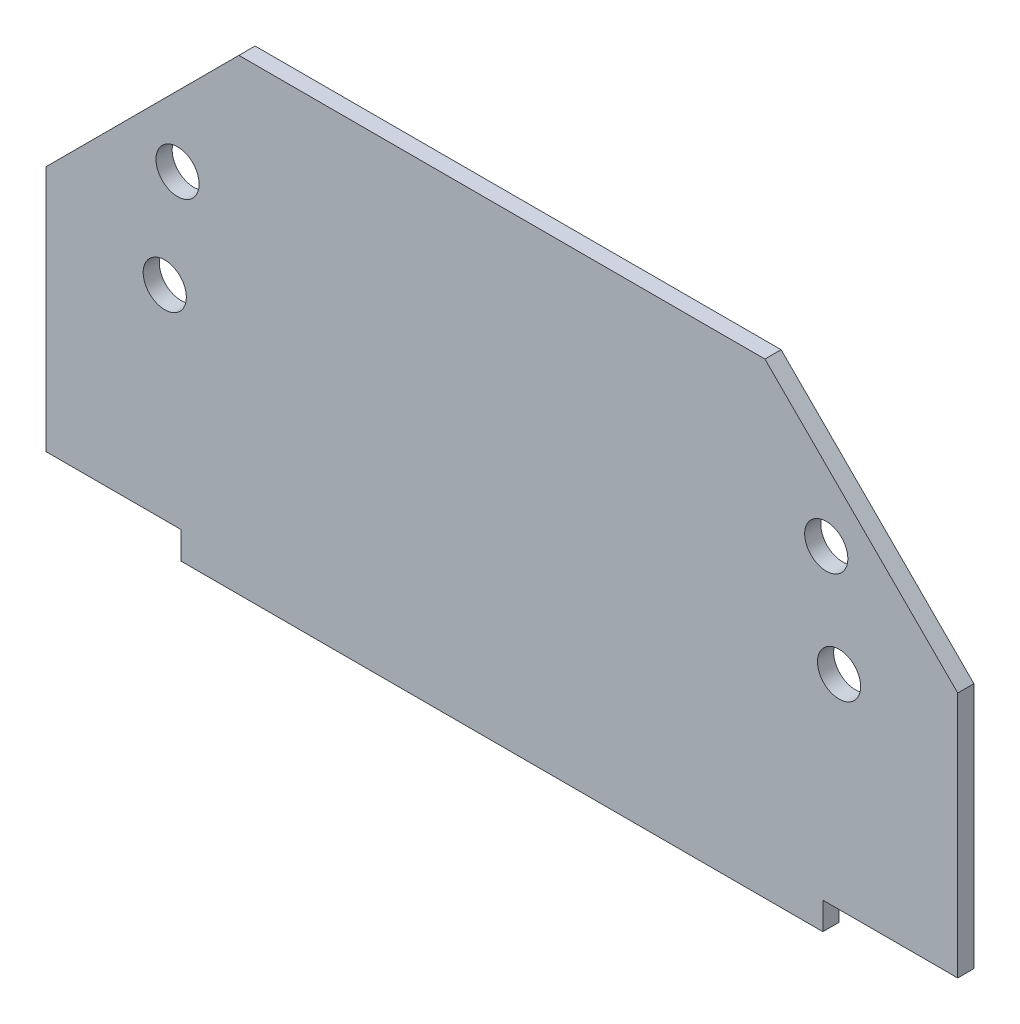
ISO-10303-21;
HEADER;
FILE_DESCRIPTION(('STEP AP214'),'2;1');
FILE_NAME('part.step','',(''),(''),'','','');
FILE_SCHEMA(('AUTOMOTIVE_DESIGN { 1 0 10303 214 1 1 1 1 }'));
ENDSEC;
DATA;
#1=APPLICATION_CONTEXT('core data for automotive mechanical design processes');
#2=APPLICATION_PROTOCOL_DEFINITION('international standard','automotive_design',2000,#1);
#3=PRODUCT_CONTEXT('',#1,'mechanical');
#4=PRODUCT('Part','Part','',(#3));
#5=PRODUCT_RELATED_PRODUCT_CATEGORY('part','',(#4));
#6=PRODUCT_DEFINITION_FORMATION('','',#4);
#7=PRODUCT_DEFINITION_CONTEXT('part definition',#1,'design');
#8=PRODUCT_DEFINITION('design','',#6,#7);
#9=PRODUCT_DEFINITION_SHAPE('','',#8);
#10=(LENGTH_UNIT() NAMED_UNIT(*) SI_UNIT(.MILLI.,.METRE.));
#11=(NAMED_UNIT(*) PLANE_ANGLE_UNIT() SI_UNIT($,.RADIAN.));
#12=(NAMED_UNIT(*) SI_UNIT($,.STERADIAN.) SOLID_ANGLE_UNIT());
#13=UNCERTAINTY_MEASURE_WITH_UNIT(LENGTH_MEASURE(1.E-05),#10,'distance_accuracy_value','');
#14=(GEOMETRIC_REPRESENTATION_CONTEXT(3) GLOBAL_UNCERTAINTY_ASSIGNED_CONTEXT((#13)) GLOBAL_UNIT_ASSIGNED_CONTEXT((#10,
#11,#12)) REPRESENTATION_CONTEXT('',''));
#15=CARTESIAN_POINT('',(0.,0.,0.));
#16=DIRECTION('',(0.,0.,1.));
#17=DIRECTION('',(1.,0.,0.));
#18=AXIS2_PLACEMENT_3D('',#15,#16,#17);
#19=CARTESIAN_POINT('',(0.,0.,1.2));
#20=DIRECTION('',(0.,0.,-1.));
#21=DIRECTION('',(-1.,0.,0.));
#22=AXIS2_PLACEMENT_3D('',#19,#20,#21);
#23=PLANE('',#22);
#24=DIRECTION('',(1.,0.,0.));
#25=VECTOR('',#24,1.);
#26=CARTESIAN_POINT('',(-33.8,12.7867821934849,1.2));
#27=LINE('',#26,#25);
#28=CARTESIAN_POINT('',(-33.8,12.7867821934849,1.2));
#29=VERTEX_POINT('',#28);
#30=CARTESIAN_POINT('',(-23.8,12.7867821934849,1.2));
#31=VERTEX_POINT('',#30);
#32=EDGE_CURVE('E165',#29,#31,#27,.T.);
#33=ORIENTED_EDGE('',*,*,#32,.T.);
#34=DIRECTION('',(0.,-1.,0.));
#35=VECTOR('',#34,1.);
#36=CARTESIAN_POINT('',(-23.8,12.7867821934849,1.2));
#37=LINE('',#36,#35);
#38=CARTESIAN_POINT('',(-23.8,10.7587722464482,1.2));
#39=VERTEX_POINT('',#38);
#40=EDGE_CURVE('E103',#31,#39,#37,.T.);
#41=ORIENTED_EDGE('',*,*,#40,.T.);
#42=DIRECTION('',(1.,0.,0.));
#43=VECTOR('',#42,1.);
#44=CARTESIAN_POINT('',(-23.8,10.7587722464482,1.2));
#45=LINE('',#44,#43);
#46=CARTESIAN_POINT('',(23.8,10.7587722464482,1.2));
#47=VERTEX_POINT('',#46);
#48=EDGE_CURVE('E186',#39,#47,#45,.T.);
#49=ORIENTED_EDGE('',*,*,#48,.T.);
#50=DIRECTION('',(0.,1.,0.));
#51=VECTOR('',#50,1.);
#52=CARTESIAN_POINT('',(23.8,12.7867821934849,1.2));
#53=LINE('',#52,#51);
#54=CARTESIAN_POINT('',(23.8,12.7867821934849,1.2));
#55=VERTEX_POINT('',#54);
#56=EDGE_CURVE('E205',#47,#55,#53,.T.);
#57=ORIENTED_EDGE('',*,*,#56,.T.);
#58=DIRECTION('',(1.,0.,0.));
#59=VECTOR('',#58,1.);
#60=CARTESIAN_POINT('',(33.8,12.7867821934849,1.2));
#61=LINE('',#60,#59);
#62=CARTESIAN_POINT('',(33.8,12.7867821934849,1.2));
#63=VERTEX_POINT('',#62);
#64=EDGE_CURVE('E202',#55,#63,#61,.T.);
#65=ORIENTED_EDGE('',*,*,#64,.T.);
#66=DIRECTION('',(0.,1.,0.));
#67=VECTOR('',#66,1.);
#68=CARTESIAN_POINT('',(33.8,12.7867821934849,1.2));
#69=LINE('',#68,#67);
#70=CARTESIAN_POINT('',(33.8,31.0897259186372,1.2));
#71=VERTEX_POINT('',#70);
#72=EDGE_CURVE('E204',#63,#71,#69,.T.);
#73=ORIENTED_EDGE('',*,*,#72,.T.);
#74=DIRECTION('',(-0.707106781186547,0.707106781186548,0.));
#75=VECTOR('',#74,1.);
#76=CARTESIAN_POINT('',(33.8,31.0897259186372,1.2));
#77=LINE('',#76,#75);
#78=CARTESIAN_POINT('',(19.5029437251523,45.3867821934849,1.2));
#79=VERTEX_POINT('',#78);
#80=EDGE_CURVE('E128',#71,#79,#77,.T.);
#81=ORIENTED_EDGE('',*,*,#80,.T.);
#82=DIRECTION('',(-1.,0.,0.));
#83=VECTOR('',#82,1.);
#84=CARTESIAN_POINT('',(-19.5029437251523,45.3867821934849,1.2));
#85=LINE('',#84,#83);
#86=CARTESIAN_POINT('',(-19.5029437251523,45.3867821934849,1.2));
#87=VERTEX_POINT('',#86);
#88=EDGE_CURVE('E122',#79,#87,#85,.T.);
#89=ORIENTED_EDGE('',*,*,#88,.T.);
#90=DIRECTION('',(-0.707106781186547,-0.707106781186548,0.));
#91=VECTOR('',#90,1.);
#92=CARTESIAN_POINT('',(-33.8,31.0897259186372,1.2));
#93=LINE('',#92,#91);
#94=CARTESIAN_POINT('',(-33.8,31.0897259186372,1.2));
#95=VERTEX_POINT('',#94);
#96=EDGE_CURVE('E126',#87,#95,#93,.T.);
#97=ORIENTED_EDGE('',*,*,#96,.T.);
#98=DIRECTION('',(0.,-1.,0.));
#99=VECTOR('',#98,1.);
#100=CARTESIAN_POINT('',(-33.8,12.7867821934849,1.2));
#101=LINE('',#100,#99);
#102=EDGE_CURVE('E54',#95,#29,#101,.T.);
#103=ORIENTED_EDGE('',*,*,#102,.T.);
#104=EDGE_LOOP('',(#33,#41,#49,#57,#65,#73,#81,#89,#97,#103));
#105=FACE_BOUND('',#104,.T.);
#106=CARTESIAN_POINT('',(-25.,27.9005664490516,1.2));
#107=DIRECTION('',(0.,0.,1.));
#108=DIRECTION('',(1.,0.,0.));
#109=AXIS2_PLACEMENT_3D('',#106,#107,#108);
#110=CIRCLE('',#109,1.6);
#111=CARTESIAN_POINT('',(-23.4,27.9005664490516,1.2));
#112=VERTEX_POINT('',#111);
#113=EDGE_CURVE('E150',#112,#112,#110,.T.);
#114=ORIENTED_EDGE('',*,*,#113,.F.);
#115=EDGE_LOOP('',(#114));
#116=FACE_BOUND('',#115,.T.);
#117=CARTESIAN_POINT('',(-24.0524805019972,35.6392626954821,1.2));
#118=DIRECTION('',(0.,0.,1.));
#119=DIRECTION('',(1.,0.,0.));
#120=AXIS2_PLACEMENT_3D('',#117,#118,#119);
#121=CIRCLE('',#120,1.60000000000001);
#122=CARTESIAN_POINT('',(-22.4524805019972,35.6392626954821,1.2));
#123=VERTEX_POINT('',#122);
#124=EDGE_CURVE('E216',#123,#123,#121,.T.);
#125=ORIENTED_EDGE('',*,*,#124,.F.);
#126=EDGE_LOOP('',(#125));
#127=FACE_BOUND('',#126,.T.);
#128=CARTESIAN_POINT('',(24.0524805019972,35.6392626954821,1.2));
#129=DIRECTION('',(0.,0.,1.));
#130=DIRECTION('',(1.,0.,0.));
#131=AXIS2_PLACEMENT_3D('',#128,#129,#130);
#132=CIRCLE('',#131,1.59999999999999);
#133=CARTESIAN_POINT('',(25.6524805019972,35.6392626954821,1.2));
#134=VERTEX_POINT('',#133);
#135=EDGE_CURVE('E222',#134,#134,#132,.T.);
#136=ORIENTED_EDGE('',*,*,#135,.F.);
#137=EDGE_LOOP('',(#136));
#138=FACE_BOUND('',#137,.T.);
#139=CARTESIAN_POINT('',(25.,27.9005664490517,1.2));
#140=DIRECTION('',(0.,0.,1.));
#141=DIRECTION('',(1.,0.,0.));
#142=AXIS2_PLACEMENT_3D('',#139,#140,#141);
#143=CIRCLE('',#142,1.6);
#144=CARTESIAN_POINT('',(26.6,27.9005664490517,1.2));
#145=VERTEX_POINT('',#144);
#146=EDGE_CURVE('E228',#145,#145,#143,.T.);
#147=ORIENTED_EDGE('',*,*,#146,.F.);
#148=EDGE_LOOP('',(#147));
#149=FACE_BOUND('',#148,.T.);
#150=ADVANCED_FACE('F37',(#105,#116,#127,#138,#149),#23,.F.);
#151=CARTESIAN_POINT('',(0.,0.,0.));
#152=DIRECTION('',(0.,0.,-1.));
#153=DIRECTION('',(-1.,0.,0.));
#154=AXIS2_PLACEMENT_3D('',#151,#152,#153);
#155=PLANE('',#154);
#156=CARTESIAN_POINT('',(24.0524805019972,35.6392626954821,0.));
#157=DIRECTION('',(0.,0.,1.));
#158=DIRECTION('',(1.,0.,0.));
#159=AXIS2_PLACEMENT_3D('',#156,#157,#158);
#160=CIRCLE('',#159,1.59999999999999);
#161=CARTESIAN_POINT('',(25.6524805019972,35.6392626954821,0.));
#162=VERTEX_POINT('',#161);
#163=EDGE_CURVE('E225',#162,#162,#160,.T.);
#164=ORIENTED_EDGE('',*,*,#163,.T.);
#165=EDGE_LOOP('',(#164));
#166=FACE_BOUND('',#165,.T.);
#167=CARTESIAN_POINT('',(-25.,27.9005664490516,0.));
#168=DIRECTION('',(0.,0.,1.));
#169=DIRECTION('',(1.,0.,0.));
#170=AXIS2_PLACEMENT_3D('',#167,#168,#169);
#171=CIRCLE('',#170,1.6);
#172=CARTESIAN_POINT('',(-23.4,27.9005664490516,0.));
#173=VERTEX_POINT('',#172);
#174=EDGE_CURVE('E213',#173,#173,#171,.T.);
#175=ORIENTED_EDGE('',*,*,#174,.T.);
#176=EDGE_LOOP('',(#175));
#177=FACE_BOUND('',#176,.T.);
#178=DIRECTION('',(1.,0.,0.));
#179=VECTOR('',#178,1.);
#180=CARTESIAN_POINT('',(-33.8,12.7867821934849,0.));
#181=LINE('',#180,#179);
#182=CARTESIAN_POINT('',(-33.8,12.7867821934849,0.));
#183=VERTEX_POINT('',#182);
#184=CARTESIAN_POINT('',(-23.8,12.7867821934849,0.));
#185=VERTEX_POINT('',#184);
#186=EDGE_CURVE('E146',#183,#185,#181,.T.);
#187=ORIENTED_EDGE('',*,*,#186,.F.);
#188=DIRECTION('',(0.,-1.,0.));
#189=VECTOR('',#188,1.);
#190=CARTESIAN_POINT('',(-33.8,12.7867821934849,0.));
#191=LINE('',#190,#189);
#192=CARTESIAN_POINT('',(-33.8,31.0897259186372,0.));
#193=VERTEX_POINT('',#192);
#194=EDGE_CURVE('E95',#193,#183,#191,.T.);
#195=ORIENTED_EDGE('',*,*,#194,.F.);
#196=DIRECTION('',(-0.707106781186547,-0.707106781186548,0.));
#197=VECTOR('',#196,1.);
#198=CARTESIAN_POINT('',(-33.8,31.0897259186372,0.));
#199=LINE('',#198,#197);
#200=CARTESIAN_POINT('',(-19.5029437251523,45.3867821934849,0.));
#201=VERTEX_POINT('',#200);
#202=EDGE_CURVE('E89',#201,#193,#199,.T.);
#203=ORIENTED_EDGE('',*,*,#202,.F.);
#204=DIRECTION('',(-1.,0.,0.));
#205=VECTOR('',#204,1.);
#206=CARTESIAN_POINT('',(-19.5029437251523,45.3867821934849,0.));
#207=LINE('',#206,#205);
#208=CARTESIAN_POINT('',(19.5029437251523,45.3867821934849,0.));
#209=VERTEX_POINT('',#208);
#210=EDGE_CURVE('E136',#209,#201,#207,.T.);
#211=ORIENTED_EDGE('',*,*,#210,.F.);
#212=DIRECTION('',(-0.707106781186547,0.707106781186548,0.));
#213=VECTOR('',#212,1.);
#214=CARTESIAN_POINT('',(33.8,31.0897259186372,0.));
#215=LINE('',#214,#213);
#216=CARTESIAN_POINT('',(33.8,31.0897259186372,0.));
#217=VERTEX_POINT('',#216);
#218=EDGE_CURVE('E160',#217,#209,#215,.T.);
#219=ORIENTED_EDGE('',*,*,#218,.F.);
#220=DIRECTION('',(0.,1.,0.));
#221=VECTOR('',#220,1.);
#222=CARTESIAN_POINT('',(33.8,12.7867821934849,0.));
#223=LINE('',#222,#221);
#224=CARTESIAN_POINT('',(33.8,12.7867821934849,0.));
#225=VERTEX_POINT('',#224);
#226=EDGE_CURVE('E158',#225,#217,#223,.T.);
#227=ORIENTED_EDGE('',*,*,#226,.F.);
#228=DIRECTION('',(1.,0.,0.));
#229=VECTOR('',#228,1.);
#230=CARTESIAN_POINT('',(33.8,12.7867821934849,0.));
#231=LINE('',#230,#229);
#232=CARTESIAN_POINT('',(23.8,12.7867821934849,0.));
#233=VERTEX_POINT('',#232);
#234=EDGE_CURVE('E156',#233,#225,#231,.T.);
#235=ORIENTED_EDGE('',*,*,#234,.F.);
#236=DIRECTION('',(0.,1.,0.));
#237=VECTOR('',#236,1.);
#238=CARTESIAN_POINT('',(23.8,12.7867821934849,0.));
#239=LINE('',#238,#237);
#240=CARTESIAN_POINT('',(23.8,10.7587722464482,0.));
#241=VERTEX_POINT('',#240);
#242=EDGE_CURVE('E154',#241,#233,#239,.T.);
#243=ORIENTED_EDGE('',*,*,#242,.F.);
#244=DIRECTION('',(1.,0.,0.));
#245=VECTOR('',#244,1.);
#246=CARTESIAN_POINT('',(-23.8,10.7587722464482,0.));
#247=LINE('',#246,#245);
#248=CARTESIAN_POINT('',(-23.8,10.7587722464482,0.));
#249=VERTEX_POINT('',#248);
#250=EDGE_CURVE('E152',#249,#241,#247,.T.);
#251=ORIENTED_EDGE('',*,*,#250,.F.);
#252=DIRECTION('',(0.,-1.,0.));
#253=VECTOR('',#252,1.);
#254=CARTESIAN_POINT('',(-23.8,12.7867821934849,0.));
#255=LINE('',#254,#253);
#256=EDGE_CURVE('E149',#185,#249,#255,.T.);
#257=ORIENTED_EDGE('',*,*,#256,.F.);
#258=EDGE_LOOP('',(#187,#195,#203,#211,#219,#227,#235,#243,#251,#257));
#259=FACE_BOUND('',#258,.T.);
#260=CARTESIAN_POINT('',(-24.0524805019972,35.6392626954821,0.));
#261=DIRECTION('',(0.,0.,1.));
#262=DIRECTION('',(1.,0.,0.));
#263=AXIS2_PLACEMENT_3D('',#260,#261,#262);
#264=CIRCLE('',#263,1.60000000000001);
#265=CARTESIAN_POINT('',(-22.4524805019972,35.6392626954821,0.));
#266=VERTEX_POINT('',#265);
#267=EDGE_CURVE('E219',#266,#266,#264,.T.);
#268=ORIENTED_EDGE('',*,*,#267,.T.);
#269=EDGE_LOOP('',(#268));
#270=FACE_BOUND('',#269,.T.);
#271=CARTESIAN_POINT('',(25.,27.9005664490517,0.));
#272=DIRECTION('',(0.,0.,1.));
#273=DIRECTION('',(1.,0.,0.));
#274=AXIS2_PLACEMENT_3D('',#271,#272,#273);
#275=CIRCLE('',#274,1.6);
#276=CARTESIAN_POINT('',(26.6,27.9005664490517,0.));
#277=VERTEX_POINT('',#276);
#278=EDGE_CURVE('E231',#277,#277,#275,.T.);
#279=ORIENTED_EDGE('',*,*,#278,.T.);
#280=EDGE_LOOP('',(#279));
#281=FACE_BOUND('',#280,.T.);
#282=ADVANCED_FACE('F190',(#166,#177,#259,#270,#281),#155,.T.);
#283=CARTESIAN_POINT('',(-33.8,12.7867821934849,1.2));
#284=DIRECTION('',(0.,1.,0.));
#285=DIRECTION('',(0.,0.,1.));
#286=AXIS2_PLACEMENT_3D('',#283,#284,#285);
#287=PLANE('',#286);
#288=ORIENTED_EDGE('',*,*,#186,.T.);
#289=DIRECTION('',(0.,0.,-1.));
#290=VECTOR('',#289,1.);
#291=CARTESIAN_POINT('',(-23.8,12.7867821934849,1.2));
#292=LINE('',#291,#290);
#293=EDGE_CURVE('E11',#31,#185,#292,.T.);
#294=ORIENTED_EDGE('',*,*,#293,.F.);
#295=ORIENTED_EDGE('',*,*,#32,.F.);
#296=DIRECTION('',(0.,0.,-1.));
#297=VECTOR('',#296,1.);
#298=CARTESIAN_POINT('',(-33.8,12.7867821934849,1.2));
#299=LINE('',#298,#297);
#300=EDGE_CURVE('E142',#29,#183,#299,.T.);
#301=ORIENTED_EDGE('',*,*,#300,.T.);
#302=EDGE_LOOP('',(#288,#294,#295,#301));
#303=FACE_BOUND('',#302,.T.);
#304=ADVANCED_FACE('F39',(#303),#287,.F.);
#305=CARTESIAN_POINT('',(-23.8,12.7867821934849,1.2));
#306=DIRECTION('',(1.,0.,0.));
#307=DIRECTION('',(0.,0.,-1.));
#308=AXIS2_PLACEMENT_3D('',#305,#306,#307);
#309=PLANE('',#308);
#310=ORIENTED_EDGE('',*,*,#256,.T.);
#311=DIRECTION('',(0.,0.,-1.));
#312=VECTOR('',#311,1.);
#313=CARTESIAN_POINT('',(-23.8,10.7587722464482,1.2));
#314=LINE('',#313,#312);
#315=EDGE_CURVE('E46',#39,#249,#314,.T.);
#316=ORIENTED_EDGE('',*,*,#315,.F.);
#317=ORIENTED_EDGE('',*,*,#40,.F.);
#318=ORIENTED_EDGE('',*,*,#293,.T.);
#319=EDGE_LOOP('',(#310,#316,#317,#318));
#320=FACE_BOUND('',#319,.T.);
#321=ADVANCED_FACE('F271',(#320),#309,.F.);
#322=CARTESIAN_POINT('',(-23.8,10.7587722464482,1.2));
#323=DIRECTION('',(0.,1.,0.));
#324=DIRECTION('',(0.,0.,1.));
#325=AXIS2_PLACEMENT_3D('',#322,#323,#324);
#326=PLANE('',#325);
#327=ORIENTED_EDGE('',*,*,#250,.T.);
#328=DIRECTION('',(0.,0.,-1.));
#329=VECTOR('',#328,1.);
#330=CARTESIAN_POINT('',(23.8,10.7587722464482,1.2));
#331=LINE('',#330,#329);
#332=EDGE_CURVE('E178',#47,#241,#331,.T.);
#333=ORIENTED_EDGE('',*,*,#332,.F.);
#334=ORIENTED_EDGE('',*,*,#48,.F.);
#335=ORIENTED_EDGE('',*,*,#315,.T.);
#336=EDGE_LOOP('',(#327,#333,#334,#335));
#337=FACE_BOUND('',#336,.T.);
#338=ADVANCED_FACE('F184',(#337),#326,.F.);
#339=CARTESIAN_POINT('',(23.8,12.7867821934849,1.2));
#340=DIRECTION('',(-1.,0.,0.));
#341=DIRECTION('',(0.,0.,1.));
#342=AXIS2_PLACEMENT_3D('',#339,#340,#341);
#343=PLANE('',#342);
#344=ORIENTED_EDGE('',*,*,#242,.T.);
#345=DIRECTION('',(0.,0.,-1.));
#346=VECTOR('',#345,1.);
#347=CARTESIAN_POINT('',(23.8,12.7867821934849,1.2));
#348=LINE('',#347,#346);
#349=EDGE_CURVE('E175',#55,#233,#348,.T.);
#350=ORIENTED_EDGE('',*,*,#349,.F.);
#351=ORIENTED_EDGE('',*,*,#56,.F.);
#352=ORIENTED_EDGE('',*,*,#332,.T.);
#353=EDGE_LOOP('',(#344,#350,#351,#352));
#354=FACE_BOUND('',#353,.T.);
#355=ADVANCED_FACE('F196',(#354),#343,.F.);
#356=CARTESIAN_POINT('',(33.8,12.7867821934849,1.2));
#357=DIRECTION('',(0.,1.,0.));
#358=DIRECTION('',(0.,0.,1.));
#359=AXIS2_PLACEMENT_3D('',#356,#357,#358);
#360=PLANE('',#359);
#361=ORIENTED_EDGE('',*,*,#234,.T.);
#362=DIRECTION('',(0.,0.,-1.));
#363=VECTOR('',#362,1.);
#364=CARTESIAN_POINT('',(33.8,12.7867821934849,1.2));
#365=LINE('',#364,#363);
#366=EDGE_CURVE('E172',#63,#225,#365,.T.);
#367=ORIENTED_EDGE('',*,*,#366,.F.);
#368=ORIENTED_EDGE('',*,*,#64,.F.);
#369=ORIENTED_EDGE('',*,*,#349,.T.);
#370=EDGE_LOOP('',(#361,#367,#368,#369));
#371=FACE_BOUND('',#370,.T.);
#372=ADVANCED_FACE('F200',(#371),#360,.F.);
#373=CARTESIAN_POINT('',(33.8,12.7867821934849,1.2));
#374=DIRECTION('',(-1.,0.,0.));
#375=DIRECTION('',(0.,0.,1.));
#376=AXIS2_PLACEMENT_3D('',#373,#374,#375);
#377=PLANE('',#376);
#378=ORIENTED_EDGE('',*,*,#226,.T.);
#379=DIRECTION('',(0.,0.,-1.));
#380=VECTOR('',#379,1.);
#381=CARTESIAN_POINT('',(33.8,31.0897259186372,1.2));
#382=LINE('',#381,#380);
#383=EDGE_CURVE('E169',#71,#217,#382,.T.);
#384=ORIENTED_EDGE('',*,*,#383,.F.);
#385=ORIENTED_EDGE('',*,*,#72,.F.);
#386=ORIENTED_EDGE('',*,*,#366,.T.);
#387=EDGE_LOOP('',(#378,#384,#385,#386));
#388=FACE_BOUND('',#387,.T.);
#389=ADVANCED_FACE('F261',(#388),#377,.F.);
#390=CARTESIAN_POINT('',(33.8,31.0897259186372,1.2));
#391=DIRECTION('',(-0.707106781186548,-0.707106781186547,0.));
#392=DIRECTION('',(0.707106781186547,-0.707106781186548,0.));
#393=AXIS2_PLACEMENT_3D('',#390,#391,#392);
#394=PLANE('',#393);
#395=ORIENTED_EDGE('',*,*,#218,.T.);
#396=DIRECTION('',(0.,0.,-1.));
#397=VECTOR('',#396,1.);
#398=CARTESIAN_POINT('',(19.5029437251523,45.3867821934849,1.2));
#399=LINE('',#398,#397);
#400=EDGE_CURVE('E137',#79,#209,#399,.T.);
#401=ORIENTED_EDGE('',*,*,#400,.F.);
#402=ORIENTED_EDGE('',*,*,#80,.F.);
#403=ORIENTED_EDGE('',*,*,#383,.T.);
#404=EDGE_LOOP('',(#395,#401,#402,#403));
#405=FACE_BOUND('',#404,.T.);
#406=ADVANCED_FACE('F258',(#405),#394,.F.);
#407=CARTESIAN_POINT('',(-19.5029437251523,45.3867821934849,1.2));
#408=DIRECTION('',(0.,-1.,0.));
#409=DIRECTION('',(0.,0.,-1.));
#410=AXIS2_PLACEMENT_3D('',#407,#408,#409);
#411=PLANE('',#410);
#412=ORIENTED_EDGE('',*,*,#210,.T.);
#413=DIRECTION('',(0.,0.,-1.));
#414=VECTOR('',#413,1.);
#415=CARTESIAN_POINT('',(-19.5029437251523,45.3867821934849,1.2));
#416=LINE('',#415,#414);
#417=EDGE_CURVE('E133',#87,#201,#416,.T.);
#418=ORIENTED_EDGE('',*,*,#417,.F.);
#419=ORIENTED_EDGE('',*,*,#88,.F.);
#420=ORIENTED_EDGE('',*,*,#400,.T.);
#421=EDGE_LOOP('',(#412,#418,#419,#420));
#422=FACE_BOUND('',#421,.T.);
#423=ADVANCED_FACE('F134',(#422),#411,.F.);
#424=CARTESIAN_POINT('',(-33.8,31.0897259186372,1.2));
#425=DIRECTION('',(0.707106781186548,-0.707106781186547,0.));
#426=DIRECTION('',(0.707106781186547,0.707106781186548,0.));
#427=AXIS2_PLACEMENT_3D('',#424,#425,#426);
#428=PLANE('',#427);
#429=ORIENTED_EDGE('',*,*,#202,.T.);
#430=DIRECTION('',(0.,0.,-1.));
#431=VECTOR('',#430,1.);
#432=CARTESIAN_POINT('',(-33.8,31.0897259186372,1.2));
#433=LINE('',#432,#431);
#434=EDGE_CURVE('E138',#95,#193,#433,.T.);
#435=ORIENTED_EDGE('',*,*,#434,.F.);
#436=ORIENTED_EDGE('',*,*,#96,.F.);
#437=ORIENTED_EDGE('',*,*,#417,.T.);
#438=EDGE_LOOP('',(#429,#435,#436,#437));
#439=FACE_BOUND('',#438,.T.);
#440=ADVANCED_FACE('F140',(#439),#428,.F.);
#441=CARTESIAN_POINT('',(-33.8,12.7867821934849,1.2));
#442=DIRECTION('',(1.,0.,0.));
#443=DIRECTION('',(0.,0.,-1.));
#444=AXIS2_PLACEMENT_3D('',#441,#442,#443);
#445=PLANE('',#444);
#446=ORIENTED_EDGE('',*,*,#194,.T.);
#447=ORIENTED_EDGE('',*,*,#300,.F.);
#448=ORIENTED_EDGE('',*,*,#102,.F.);
#449=ORIENTED_EDGE('',*,*,#434,.T.);
#450=EDGE_LOOP('',(#446,#447,#448,#449));
#451=FACE_BOUND('',#450,.T.);
#452=ADVANCED_FACE('F251',(#451),#445,.F.);
#453=CARTESIAN_POINT('',(-25.,27.9005664490516,1.2));
#454=DIRECTION('',(0.,0.,-1.));
#455=DIRECTION('',(-1.,0.,0.));
#456=AXIS2_PLACEMENT_3D('',#453,#454,#455);
#457=CYLINDRICAL_SURFACE('',#456,1.6);
#458=ORIENTED_EDGE('',*,*,#113,.T.);
#459=EDGE_LOOP('',(#458));
#460=FACE_BOUND('',#459,.T.);
#461=ORIENTED_EDGE('',*,*,#174,.F.);
#462=EDGE_LOOP('',(#461));
#463=FACE_BOUND('',#462,.T.);
#464=ADVANCED_FACE('F248',(#460,#463),#457,.F.);
#465=CARTESIAN_POINT('',(-24.0524805019972,35.6392626954821,1.2));
#466=DIRECTION('',(0.,0.,-1.));
#467=DIRECTION('',(-1.,0.,0.));
#468=AXIS2_PLACEMENT_3D('',#465,#466,#467);
#469=CYLINDRICAL_SURFACE('',#468,1.60000000000001);
#470=ORIENTED_EDGE('',*,*,#124,.T.);
#471=EDGE_LOOP('',(#470));
#472=FACE_BOUND('',#471,.T.);
#473=ORIENTED_EDGE('',*,*,#267,.F.);
#474=EDGE_LOOP('',(#473));
#475=FACE_BOUND('',#474,.T.);
#476=ADVANCED_FACE('F361',(#472,#475),#469,.F.);
#477=CARTESIAN_POINT('',(24.0524805019972,35.6392626954821,1.2));
#478=DIRECTION('',(0.,0.,-1.));
#479=DIRECTION('',(-1.,0.,0.));
#480=AXIS2_PLACEMENT_3D('',#477,#478,#479);
#481=CYLINDRICAL_SURFACE('',#480,1.59999999999999);
#482=ORIENTED_EDGE('',*,*,#135,.T.);
#483=EDGE_LOOP('',(#482));
#484=FACE_BOUND('',#483,.T.);
#485=ORIENTED_EDGE('',*,*,#163,.F.);
#486=EDGE_LOOP('',(#485));
#487=FACE_BOUND('',#486,.T.);
#488=ADVANCED_FACE('F370',(#484,#487),#481,.F.);
#489=CARTESIAN_POINT('',(25.,27.9005664490517,1.2));
#490=DIRECTION('',(0.,0.,-1.));
#491=DIRECTION('',(-1.,0.,0.));
#492=AXIS2_PLACEMENT_3D('',#489,#490,#491);
#493=CYLINDRICAL_SURFACE('',#492,1.6);
#494=ORIENTED_EDGE('',*,*,#146,.T.);
#495=EDGE_LOOP('',(#494));
#496=FACE_BOUND('',#495,.T.);
#497=ORIENTED_EDGE('',*,*,#278,.F.);
#498=EDGE_LOOP('',(#497));
#499=FACE_BOUND('',#498,.T.);
#500=ADVANCED_FACE('F237',(#496,#499),#493,.F.);
#501=CLOSED_SHELL('',(#150,#282,#304,#321,#338,#355,#372,#389,#406,#423,#440,#452,#464,#476,
#488,#500));
#502=MANIFOLD_SOLID_BREP('B2',#501);
#503=ADVANCED_BREP_SHAPE_REPRESENTATION('',(#18,#502),#14);
#504=SHAPE_DEFINITION_REPRESENTATION(#9,#503);
ENDSEC;
END-ISO-10303-21;
